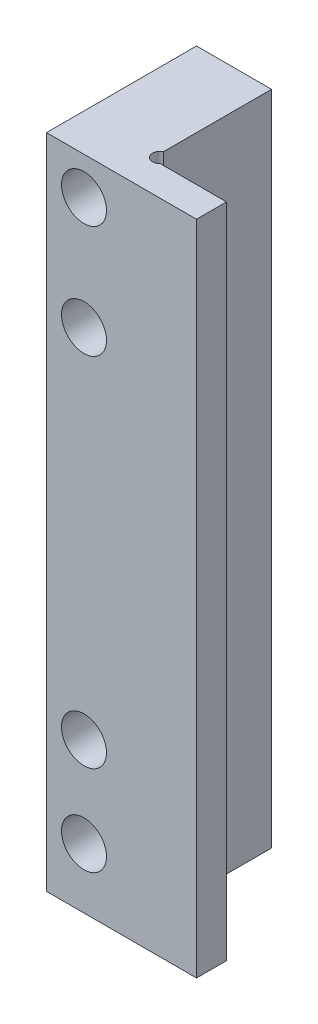
ISO-10303-21;
HEADER;
FILE_DESCRIPTION(('STEP AP214'),'2;1');
FILE_NAME('part.step','',(''),(''),'','','');
FILE_SCHEMA(('AUTOMOTIVE_DESIGN { 1 0 10303 214 1 1 1 1 }'));
ENDSEC;
DATA;
#1=APPLICATION_CONTEXT('core data for automotive mechanical design processes');
#2=APPLICATION_PROTOCOL_DEFINITION('international standard','automotive_design',2000,#1);
#3=PRODUCT_CONTEXT('',#1,'mechanical');
#4=PRODUCT('Part','Part','',(#3));
#5=PRODUCT_RELATED_PRODUCT_CATEGORY('part','',(#4));
#6=PRODUCT_DEFINITION_FORMATION('','',#4);
#7=PRODUCT_DEFINITION_CONTEXT('part definition',#1,'design');
#8=PRODUCT_DEFINITION('design','',#6,#7);
#9=PRODUCT_DEFINITION_SHAPE('','',#8);
#10=(LENGTH_UNIT() NAMED_UNIT(*) SI_UNIT(.MILLI.,.METRE.));
#11=(NAMED_UNIT(*) PLANE_ANGLE_UNIT() SI_UNIT($,.RADIAN.));
#12=(NAMED_UNIT(*) SI_UNIT($,.STERADIAN.) SOLID_ANGLE_UNIT());
#13=UNCERTAINTY_MEASURE_WITH_UNIT(LENGTH_MEASURE(1.E-05),#10,'distance_accuracy_value','');
#14=(GEOMETRIC_REPRESENTATION_CONTEXT(3) GLOBAL_UNCERTAINTY_ASSIGNED_CONTEXT((#13)) GLOBAL_UNIT_ASSIGNED_CONTEXT((#10,
#11,#12)) REPRESENTATION_CONTEXT('',''));
#15=CARTESIAN_POINT('',(0.,0.,0.));
#16=DIRECTION('',(0.,0.,1.));
#17=DIRECTION('',(1.,0.,0.));
#18=AXIS2_PLACEMENT_3D('',#15,#16,#17);
#19=CARTESIAN_POINT('',(-34.9,21.9,-10.));
#20=DIRECTION('',(-1.,0.,0.));
#21=DIRECTION('',(0.,0.,1.));
#22=AXIS2_PLACEMENT_3D('',#19,#20,#21);
#23=PLANE('',#22);
#24=DIRECTION('',(0.,-1.,0.));
#25=VECTOR('',#24,1.);
#26=CARTESIAN_POINT('',(-34.9,21.9,0.));
#27=LINE('',#26,#25);
#28=CARTESIAN_POINT('',(-34.9,21.9,0.));
#29=VERTEX_POINT('',#28);
#30=CARTESIAN_POINT('',(-34.9,-21.9,0.));
#31=VERTEX_POINT('',#30);
#32=EDGE_CURVE('E103',#29,#31,#27,.T.);
#33=ORIENTED_EDGE('',*,*,#32,.F.);
#34=DIRECTION('',(0.,0.,1.));
#35=VECTOR('',#34,1.);
#36=CARTESIAN_POINT('',(-34.9,21.9,-10.));
#37=LINE('',#36,#35);
#38=CARTESIAN_POINT('',(-34.9,21.9,-10.));
#39=VERTEX_POINT('',#38);
#40=EDGE_CURVE('E12',#39,#29,#37,.T.);
#41=ORIENTED_EDGE('',*,*,#40,.F.);
#42=DIRECTION('',(0.,-1.,0.));
#43=VECTOR('',#42,1.);
#44=CARTESIAN_POINT('',(-34.9,21.9,-10.));
#45=LINE('',#44,#43);
#46=CARTESIAN_POINT('',(-34.9,-21.9,-10.));
#47=VERTEX_POINT('',#46);
#48=EDGE_CURVE('E114',#39,#47,#45,.T.);
#49=ORIENTED_EDGE('',*,*,#48,.T.);
#50=DIRECTION('',(0.,0.,1.));
#51=VECTOR('',#50,1.);
#52=CARTESIAN_POINT('',(-34.9,-21.9,-10.));
#53=LINE('',#52,#51);
#54=EDGE_CURVE('E55',#47,#31,#53,.T.);
#55=ORIENTED_EDGE('',*,*,#54,.T.);
#56=EDGE_LOOP('',(#33,#41,#49,#55));
#57=FACE_BOUND('',#56,.T.);
#58=ADVANCED_FACE('F52',(#57),#23,.T.);
#59=CARTESIAN_POINT('',(-34.9,21.9,-10.));
#60=DIRECTION('',(0.,1.,0.));
#61=DIRECTION('',(-1.,0.,0.));
#62=AXIS2_PLACEMENT_3D('',#59,#60,#61);
#63=PLANE('',#62);
#64=DIRECTION('',(-1.,0.,0.));
#65=VECTOR('',#64,1.);
#66=CARTESIAN_POINT('',(0.,21.8999999999999,-2.));
#67=LINE('',#66,#65);
#68=CARTESIAN_POINT('',(-24.8999999999999,21.9,-2.));
#69=VERTEX_POINT('',#68);
#70=CARTESIAN_POINT('',(-29.3226741385377,21.9,-2.));
#71=VERTEX_POINT('',#70);
#72=EDGE_CURVE('E136',#69,#71,#67,.T.);
#73=ORIENTED_EDGE('',*,*,#72,.T.);
#74=CARTESIAN_POINT('',(-29.6839888814211,21.9,-2.34561778972609));
#75=DIRECTION('',(0.,-1.,0.));
#76=DIRECTION('',(1.,0.,0.));
#77=AXIS2_PLACEMENT_3D('',#74,#75,#76);
#78=CIRCLE('',#77,0.499999999999999);
#79=CARTESIAN_POINT('',(-29.8999999999999,21.9,-2.79654926639447));
#80=VERTEX_POINT('',#79);
#81=EDGE_CURVE('E145',#71,#80,#78,.T.);
#82=ORIENTED_EDGE('',*,*,#81,.T.);
#83=DIRECTION('',(0.,0.,-1.));
#84=VECTOR('',#83,1.);
#85=CARTESIAN_POINT('',(-29.8999999999999,21.9,0.));
#86=LINE('',#85,#84);
#87=CARTESIAN_POINT('',(-29.8999999999999,21.9,-10.));
#88=VERTEX_POINT('',#87);
#89=EDGE_CURVE('E141',#80,#88,#86,.T.);
#90=ORIENTED_EDGE('',*,*,#89,.T.);
#91=DIRECTION('',(-1.,0.,0.));
#92=VECTOR('',#91,1.);
#93=CARTESIAN_POINT('',(-34.9,21.9,-10.));
#94=LINE('',#93,#92);
#95=EDGE_CURVE('E76',#88,#39,#94,.T.);
#96=ORIENTED_EDGE('',*,*,#95,.T.);
#97=ORIENTED_EDGE('',*,*,#40,.T.);
#98=DIRECTION('',(-1.,0.,0.));
#99=VECTOR('',#98,1.);
#100=CARTESIAN_POINT('',(-34.9,21.9,0.));
#101=LINE('',#100,#99);
#102=CARTESIAN_POINT('',(-24.9,21.9,0.));
#103=VERTEX_POINT('',#102);
#104=EDGE_CURVE('E98',#103,#29,#101,.T.);
#105=ORIENTED_EDGE('',*,*,#104,.F.);
#106=DIRECTION('',(0.,0.,1.));
#107=VECTOR('',#106,1.);
#108=CARTESIAN_POINT('',(-24.9,21.9,-10.));
#109=LINE('',#108,#107);
#110=EDGE_CURVE('E60',#69,#103,#109,.T.);
#111=ORIENTED_EDGE('',*,*,#110,.F.);
#112=EDGE_LOOP('',(#73,#82,#90,#96,#97,#105,#111));
#113=FACE_BOUND('',#112,.T.);
#114=ADVANCED_FACE('F95',(#113),#63,.T.);
#115=CARTESIAN_POINT('',(-24.9,21.9,-10.));
#116=DIRECTION('',(1.,0.,0.));
#117=DIRECTION('',(0.,1.,0.));
#118=AXIS2_PLACEMENT_3D('',#115,#116,#117);
#119=PLANE('',#118);
#120=DIRECTION('',(0.,-1.,0.));
#121=VECTOR('',#120,1.);
#122=CARTESIAN_POINT('',(-24.8999999999999,21.9,-2.));
#123=LINE('',#122,#121);
#124=CARTESIAN_POINT('',(-24.9,-21.9,-2.));
#125=VERTEX_POINT('',#124);
#126=EDGE_CURVE('E135',#69,#125,#123,.T.);
#127=ORIENTED_EDGE('',*,*,#126,.F.);
#128=ORIENTED_EDGE('',*,*,#110,.T.);
#129=DIRECTION('',(0.,1.,0.));
#130=VECTOR('',#129,1.);
#131=CARTESIAN_POINT('',(-24.9,21.9,0.));
#132=LINE('',#131,#130);
#133=CARTESIAN_POINT('',(-24.9,-21.9,0.));
#134=VERTEX_POINT('',#133);
#135=EDGE_CURVE('E113',#134,#103,#132,.T.);
#136=ORIENTED_EDGE('',*,*,#135,.F.);
#137=DIRECTION('',(0.,0.,1.));
#138=VECTOR('',#137,1.);
#139=CARTESIAN_POINT('',(-24.9,-21.9,-10.));
#140=LINE('',#139,#138);
#141=EDGE_CURVE('E121',#125,#134,#140,.T.);
#142=ORIENTED_EDGE('',*,*,#141,.F.);
#143=EDGE_LOOP('',(#127,#128,#136,#142));
#144=FACE_BOUND('',#143,.T.);
#145=ADVANCED_FACE('F233',(#144),#119,.T.);
#146=CARTESIAN_POINT('',(-24.9,-21.9,-10.));
#147=DIRECTION('',(0.,-1.,0.));
#148=DIRECTION('',(1.,0.,0.));
#149=AXIS2_PLACEMENT_3D('',#146,#147,#148);
#150=PLANE('',#149);
#151=DIRECTION('',(-1.,0.,0.));
#152=VECTOR('',#151,1.);
#153=CARTESIAN_POINT('',(0.,-21.9000000000001,-2.));
#154=LINE('',#153,#152);
#155=CARTESIAN_POINT('',(-29.3226741385379,-21.9,-2.));
#156=VERTEX_POINT('',#155);
#157=EDGE_CURVE('E167',#125,#156,#154,.T.);
#158=ORIENTED_EDGE('',*,*,#157,.F.);
#159=ORIENTED_EDGE('',*,*,#141,.T.);
#160=DIRECTION('',(1.,0.,0.));
#161=VECTOR('',#160,1.);
#162=CARTESIAN_POINT('',(-24.9,-21.9,0.));
#163=LINE('',#162,#161);
#164=EDGE_CURVE('E107',#31,#134,#163,.T.);
#165=ORIENTED_EDGE('',*,*,#164,.F.);
#166=ORIENTED_EDGE('',*,*,#54,.F.);
#167=DIRECTION('',(1.,0.,0.));
#168=VECTOR('',#167,1.);
#169=CARTESIAN_POINT('',(-24.9,-21.9,-10.));
#170=LINE('',#169,#168);
#171=CARTESIAN_POINT('',(-29.9,-21.9,-10.));
#172=VERTEX_POINT('',#171);
#173=EDGE_CURVE('E116',#47,#172,#170,.T.);
#174=ORIENTED_EDGE('',*,*,#173,.T.);
#175=DIRECTION('',(0.,0.,-1.));
#176=VECTOR('',#175,1.);
#177=CARTESIAN_POINT('',(-29.9,-21.9,0.));
#178=LINE('',#177,#176);
#179=CARTESIAN_POINT('',(-29.9,-21.9,-2.79654926639447));
#180=VERTEX_POINT('',#179);
#181=EDGE_CURVE('E68',#180,#172,#178,.T.);
#182=ORIENTED_EDGE('',*,*,#181,.F.);
#183=CARTESIAN_POINT('',(-29.6839888814212,-21.9,-2.34561778972609));
#184=DIRECTION('',(0.,-1.,0.));
#185=DIRECTION('',(1.,0.,0.));
#186=AXIS2_PLACEMENT_3D('',#183,#184,#185);
#187=CIRCLE('',#186,0.499999999999999);
#188=EDGE_CURVE('E148',#156,#180,#187,.T.);
#189=ORIENTED_EDGE('',*,*,#188,.F.);
#190=EDGE_LOOP('',(#158,#159,#165,#166,#174,#182,#189));
#191=FACE_BOUND('',#190,.T.);
#192=ADVANCED_FACE('F128',(#191),#150,.T.);
#193=CARTESIAN_POINT('',(0.,0.,-10.));
#194=DIRECTION('',(0.,0.,-1.));
#195=DIRECTION('',(-1.,0.,0.));
#196=AXIS2_PLACEMENT_3D('',#193,#194,#195);
#197=PLANE('',#196);
#198=CARTESIAN_POINT('',(-32.4,-17.9,-10.));
#199=DIRECTION('',(0.,0.,1.));
#200=DIRECTION('',(1.,0.,0.));
#201=AXIS2_PLACEMENT_3D('',#198,#199,#200);
#202=CIRCLE('',#201,1.5);
#203=CARTESIAN_POINT('',(-30.9,-17.9,-10.));
#204=VERTEX_POINT('',#203);
#205=EDGE_CURVE('E151',#204,#204,#202,.T.);
#206=ORIENTED_EDGE('',*,*,#205,.T.);
#207=EDGE_LOOP('',(#206));
#208=FACE_BOUND('',#207,.T.);
#209=CARTESIAN_POINT('',(-32.4,19.4,-10.));
#210=DIRECTION('',(0.,0.,1.));
#211=DIRECTION('',(1.,0.,0.));
#212=AXIS2_PLACEMENT_3D('',#209,#210,#211);
#213=CIRCLE('',#212,1.5);
#214=CARTESIAN_POINT('',(-30.9,19.4,-10.));
#215=VERTEX_POINT('',#214);
#216=EDGE_CURVE('E171',#215,#215,#213,.T.);
#217=ORIENTED_EDGE('',*,*,#216,.T.);
#218=EDGE_LOOP('',(#217));
#219=FACE_BOUND('',#218,.T.);
#220=DIRECTION('',(0.,-1.,0.));
#221=VECTOR('',#220,1.);
#222=CARTESIAN_POINT('',(-29.8999999999999,21.9,-10.));
#223=LINE('',#222,#221);
#224=EDGE_CURVE('E132',#88,#172,#223,.T.);
#225=ORIENTED_EDGE('',*,*,#224,.T.);
#226=ORIENTED_EDGE('',*,*,#173,.F.);
#227=ORIENTED_EDGE('',*,*,#48,.F.);
#228=ORIENTED_EDGE('',*,*,#95,.F.);
#229=EDGE_LOOP('',(#225,#226,#227,#228));
#230=FACE_BOUND('',#229,.T.);
#231=ADVANCED_FACE('F131',(#208,#219,#230),#197,.T.);
#232=CARTESIAN_POINT('',(0.,0.,0.));
#233=DIRECTION('',(0.,0.,-1.));
#234=DIRECTION('',(-1.,0.,0.));
#235=AXIS2_PLACEMENT_3D('',#232,#233,#234);
#236=PLANE('',#235);
#237=CARTESIAN_POINT('',(-32.4,11.9,0.));
#238=DIRECTION('',(0.,0.,1.));
#239=DIRECTION('',(1.,0.,0.));
#240=AXIS2_PLACEMENT_3D('',#237,#238,#239);
#241=CIRCLE('',#240,1.5);
#242=CARTESIAN_POINT('',(-30.9,11.9,0.));
#243=VERTEX_POINT('',#242);
#244=EDGE_CURVE('E189',#243,#243,#241,.T.);
#245=ORIENTED_EDGE('',*,*,#244,.F.);
#246=EDGE_LOOP('',(#245));
#247=FACE_BOUND('',#246,.T.);
#248=CARTESIAN_POINT('',(-32.4,-11.9,0.));
#249=DIRECTION('',(0.,0.,1.));
#250=DIRECTION('',(-1.,0.,0.));
#251=AXIS2_PLACEMENT_3D('',#248,#249,#250);
#252=CIRCLE('',#251,1.5);
#253=CARTESIAN_POINT('',(-33.9,-11.9,0.));
#254=VERTEX_POINT('',#253);
#255=EDGE_CURVE('E186',#254,#254,#252,.T.);
#256=ORIENTED_EDGE('',*,*,#255,.F.);
#257=EDGE_LOOP('',(#256));
#258=FACE_BOUND('',#257,.T.);
#259=CARTESIAN_POINT('',(-32.4,-17.9,0.));
#260=DIRECTION('',(0.,0.,1.));
#261=DIRECTION('',(1.,0.,0.));
#262=AXIS2_PLACEMENT_3D('',#259,#260,#261);
#263=CIRCLE('',#262,1.5);
#264=CARTESIAN_POINT('',(-30.9,-17.9,0.));
#265=VERTEX_POINT('',#264);
#266=EDGE_CURVE('E178',#265,#265,#263,.T.);
#267=ORIENTED_EDGE('',*,*,#266,.F.);
#268=EDGE_LOOP('',(#267));
#269=FACE_BOUND('',#268,.T.);
#270=CARTESIAN_POINT('',(-32.4,19.4,0.));
#271=DIRECTION('',(0.,0.,1.));
#272=DIRECTION('',(1.,0.,0.));
#273=AXIS2_PLACEMENT_3D('',#270,#271,#272);
#274=CIRCLE('',#273,1.5);
#275=CARTESIAN_POINT('',(-30.9,19.4,0.));
#276=VERTEX_POINT('',#275);
#277=EDGE_CURVE('E174',#276,#276,#274,.T.);
#278=ORIENTED_EDGE('',*,*,#277,.F.);
#279=EDGE_LOOP('',(#278));
#280=FACE_BOUND('',#279,.T.);
#281=ORIENTED_EDGE('',*,*,#32,.T.);
#282=ORIENTED_EDGE('',*,*,#164,.T.);
#283=ORIENTED_EDGE('',*,*,#135,.T.);
#284=ORIENTED_EDGE('',*,*,#104,.T.);
#285=EDGE_LOOP('',(#281,#282,#283,#284));
#286=FACE_BOUND('',#285,.T.);
#287=ADVANCED_FACE('F111',(#247,#258,#269,#280,#286),#236,.F.);
#288=CARTESIAN_POINT('',(0.,21.8999999999999,-2.));
#289=DIRECTION('',(0.,0.,1.));
#290=DIRECTION('',(1.,0.,0.));
#291=AXIS2_PLACEMENT_3D('',#288,#289,#290);
#292=PLANE('',#291);
#293=DIRECTION('',(0.,-1.,0.));
#294=VECTOR('',#293,1.);
#295=CARTESIAN_POINT('',(-29.3226741385377,21.9,-2.));
#296=LINE('',#295,#294);
#297=EDGE_CURVE('E139',#156,#71,#296,.F.);
#298=ORIENTED_EDGE('',*,*,#297,.T.);
#299=ORIENTED_EDGE('',*,*,#72,.F.);
#300=ORIENTED_EDGE('',*,*,#126,.T.);
#301=ORIENTED_EDGE('',*,*,#157,.T.);
#302=EDGE_LOOP('',(#298,#299,#300,#301));
#303=FACE_BOUND('',#302,.T.);
#304=ADVANCED_FACE('F206',(#303),#292,.F.);
#305=CARTESIAN_POINT('',(-29.8999999999999,21.9,0.));
#306=DIRECTION('',(-1.,0.,0.));
#307=DIRECTION('',(0.,-1.,0.));
#308=AXIS2_PLACEMENT_3D('',#305,#306,#307);
#309=PLANE('',#308);
#310=DIRECTION('',(0.,-1.,0.));
#311=VECTOR('',#310,1.);
#312=CARTESIAN_POINT('',(-29.8999999999999,21.9,-2.79654926639447));
#313=LINE('',#312,#311);
#314=EDGE_CURVE('E108',#80,#180,#313,.T.);
#315=ORIENTED_EDGE('',*,*,#314,.T.);
#316=ORIENTED_EDGE('',*,*,#181,.T.);
#317=ORIENTED_EDGE('',*,*,#224,.F.);
#318=ORIENTED_EDGE('',*,*,#89,.F.);
#319=EDGE_LOOP('',(#315,#316,#317,#318));
#320=FACE_BOUND('',#319,.T.);
#321=ADVANCED_FACE('F156',(#320),#309,.F.);
#322=CARTESIAN_POINT('',(-29.6839888814211,21.9,-2.34561778972609));
#323=DIRECTION('',(0.,-1.,0.));
#324=DIRECTION('',(1.,0.,0.));
#325=AXIS2_PLACEMENT_3D('',#322,#323,#324);
#326=CYLINDRICAL_SURFACE('',#325,0.499999999999999);
#327=ORIENTED_EDGE('',*,*,#81,.F.);
#328=ORIENTED_EDGE('',*,*,#297,.F.);
#329=ORIENTED_EDGE('',*,*,#188,.T.);
#330=ORIENTED_EDGE('',*,*,#314,.F.);
#331=EDGE_LOOP('',(#327,#328,#329,#330));
#332=FACE_BOUND('',#331,.T.);
#333=ADVANCED_FACE('F165',(#332),#326,.F.);
#334=CARTESIAN_POINT('',(-32.4,19.4,-10.));
#335=DIRECTION('',(0.,0.,1.));
#336=DIRECTION('',(1.,0.,0.));
#337=AXIS2_PLACEMENT_3D('',#334,#335,#336);
#338=CYLINDRICAL_SURFACE('',#337,1.5);
#339=ORIENTED_EDGE('',*,*,#216,.F.);
#340=EDGE_LOOP('',(#339));
#341=FACE_BOUND('',#340,.T.);
#342=ORIENTED_EDGE('',*,*,#277,.T.);
#343=EDGE_LOOP('',(#342));
#344=FACE_BOUND('',#343,.T.);
#345=ADVANCED_FACE('F214',(#341,#344),#338,.F.);
#346=CARTESIAN_POINT('',(-32.4,-17.9,-10.));
#347=DIRECTION('',(0.,0.,1.));
#348=DIRECTION('',(1.,0.,0.));
#349=AXIS2_PLACEMENT_3D('',#346,#347,#348);
#350=CYLINDRICAL_SURFACE('',#349,1.5);
#351=ORIENTED_EDGE('',*,*,#205,.F.);
#352=EDGE_LOOP('',(#351));
#353=FACE_BOUND('',#352,.T.);
#354=ORIENTED_EDGE('',*,*,#266,.T.);
#355=EDGE_LOOP('',(#354));
#356=FACE_BOUND('',#355,.T.);
#357=ADVANCED_FACE('F216',(#353,#356),#350,.F.);
#358=CARTESIAN_POINT('',(-32.4,-11.9,-5.));
#359=DIRECTION('',(0.,0.,1.));
#360=DIRECTION('',(1.,0.,0.));
#361=AXIS2_PLACEMENT_3D('',#358,#359,#360);
#362=CYLINDRICAL_SURFACE('',#361,1.5);
#363=CARTESIAN_POINT('',(-32.4,-11.9,-5.));
#364=DIRECTION('',(0.,0.,1.));
#365=DIRECTION('',(-1.,0.,0.));
#366=AXIS2_PLACEMENT_3D('',#363,#364,#365);
#367=CIRCLE('',#366,1.5);
#368=CARTESIAN_POINT('',(-33.9,-11.9,-5.));
#369=VERTEX_POINT('',#368);
#370=EDGE_CURVE('E183',#369,#369,#367,.T.);
#371=ORIENTED_EDGE('',*,*,#370,.F.);
#372=EDGE_LOOP('',(#371));
#373=FACE_BOUND('',#372,.T.);
#374=ORIENTED_EDGE('',*,*,#255,.T.);
#375=EDGE_LOOP('',(#374));
#376=FACE_BOUND('',#375,.T.);
#377=ADVANCED_FACE('F223',(#373,#376),#362,.F.);
#378=CARTESIAN_POINT('',(-32.4,-11.9,-5.));
#379=DIRECTION('',(0.,0.,-1.));
#380=DIRECTION('',(-1.,0.,0.));
#381=AXIS2_PLACEMENT_3D('',#378,#379,#380);
#382=PLANE('',#381);
#383=ORIENTED_EDGE('',*,*,#370,.T.);
#384=EDGE_LOOP('',(#383));
#385=FACE_BOUND('',#384,.T.);
#386=ADVANCED_FACE('F200',(#385),#382,.F.);
#387=CARTESIAN_POINT('',(-32.4,11.9,-5.));
#388=DIRECTION('',(0.,0.,1.));
#389=DIRECTION('',(1.,0.,0.));
#390=AXIS2_PLACEMENT_3D('',#387,#388,#389);
#391=CYLINDRICAL_SURFACE('',#390,1.5);
#392=CARTESIAN_POINT('',(-32.4,11.9,-5.));
#393=DIRECTION('',(0.,0.,1.));
#394=DIRECTION('',(1.,0.,0.));
#395=AXIS2_PLACEMENT_3D('',#392,#393,#394);
#396=CIRCLE('',#395,1.5);
#397=CARTESIAN_POINT('',(-30.9,11.9,-5.));
#398=VERTEX_POINT('',#397);
#399=EDGE_CURVE('E175',#398,#398,#396,.T.);
#400=ORIENTED_EDGE('',*,*,#399,.F.);
#401=EDGE_LOOP('',(#400));
#402=FACE_BOUND('',#401,.T.);
#403=ORIENTED_EDGE('',*,*,#244,.T.);
#404=EDGE_LOOP('',(#403));
#405=FACE_BOUND('',#404,.T.);
#406=ADVANCED_FACE('F197',(#402,#405),#391,.F.);
#407=CARTESIAN_POINT('',(-32.4,11.9,-5.));
#408=DIRECTION('',(0.,0.,1.));
#409=DIRECTION('',(1.,0.,0.));
#410=AXIS2_PLACEMENT_3D('',#407,#408,#409);
#411=PLANE('',#410);
#412=ORIENTED_EDGE('',*,*,#399,.T.);
#413=EDGE_LOOP('',(#412));
#414=FACE_BOUND('',#413,.T.);
#415=ADVANCED_FACE('F195',(#414),#411,.T.);
#416=CLOSED_SHELL('',(#58,#114,#145,#192,#231,#287,#304,#321,#333,#345,#357,#377,#386,#406,#415));
#417=MANIFOLD_SOLID_BREP('B2',#416);
#418=ADVANCED_BREP_SHAPE_REPRESENTATION('',(#18,#417),#14);
#419=SHAPE_DEFINITION_REPRESENTATION(#9,#418);
ENDSEC;
END-ISO-10303-21;
